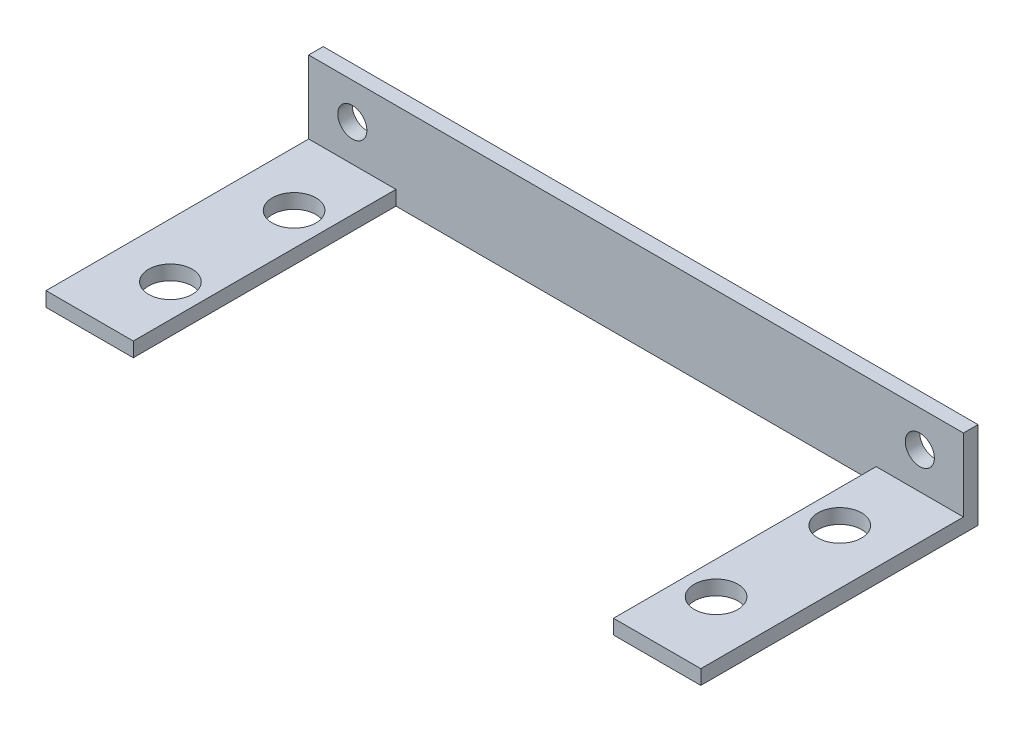
ISO-10303-21;
HEADER;
FILE_DESCRIPTION(('STEP AP214'),'2;1');
FILE_NAME('part.step','',(''),(''),'','','');
FILE_SCHEMA(('AUTOMOTIVE_DESIGN { 1 0 10303 214 1 1 1 1 }'));
ENDSEC;
DATA;
#1=APPLICATION_CONTEXT('core data for automotive mechanical design processes');
#2=APPLICATION_PROTOCOL_DEFINITION('international standard','automotive_design',2000,#1);
#3=PRODUCT_CONTEXT('',#1,'mechanical');
#4=PRODUCT('Part','Part','',(#3));
#5=PRODUCT_RELATED_PRODUCT_CATEGORY('part','',(#4));
#6=PRODUCT_DEFINITION_FORMATION('','',#4);
#7=PRODUCT_DEFINITION_CONTEXT('part definition',#1,'design');
#8=PRODUCT_DEFINITION('design','',#6,#7);
#9=PRODUCT_DEFINITION_SHAPE('','',#8);
#10=(LENGTH_UNIT() NAMED_UNIT(*) SI_UNIT(.MILLI.,.METRE.));
#11=(NAMED_UNIT(*) PLANE_ANGLE_UNIT() SI_UNIT($,.RADIAN.));
#12=(NAMED_UNIT(*) SI_UNIT($,.STERADIAN.) SOLID_ANGLE_UNIT());
#13=UNCERTAINTY_MEASURE_WITH_UNIT(LENGTH_MEASURE(1.E-05),#10,'distance_accuracy_value','');
#14=(GEOMETRIC_REPRESENTATION_CONTEXT(3) GLOBAL_UNCERTAINTY_ASSIGNED_CONTEXT((#13)) GLOBAL_UNIT_ASSIGNED_CONTEXT((#10,
#11,#12)) REPRESENTATION_CONTEXT('',''));
#15=CARTESIAN_POINT('',(0.,0.,0.));
#16=DIRECTION('',(0.,0.,1.));
#17=DIRECTION('',(1.,0.,0.));
#18=AXIS2_PLACEMENT_3D('',#15,#16,#17);
#19=CARTESIAN_POINT('',(45.,0.,38.1));
#20=DIRECTION('',(0.,0.,1.));
#21=DIRECTION('',(1.,0.,0.));
#22=AXIS2_PLACEMENT_3D('',#19,#20,#21);
#23=PLANE('',#22);
#24=DIRECTION('',(0.,-1.,0.));
#25=VECTOR('',#24,1.);
#26=CARTESIAN_POINT('',(-33.,0.,38.1));
#27=LINE('',#26,#25);
#28=CARTESIAN_POINT('',(-33.,2.,38.1));
#29=VERTEX_POINT('',#28);
#30=CARTESIAN_POINT('',(-33.,0.,38.1));
#31=VERTEX_POINT('',#30);
#32=EDGE_CURVE('E146',#29,#31,#27,.T.);
#33=ORIENTED_EDGE('',*,*,#32,.F.);
#34=DIRECTION('',(-1.,0.,0.));
#35=VECTOR('',#34,1.);
#36=CARTESIAN_POINT('',(45.,2.,38.1));
#37=LINE('',#36,#35);
#38=CARTESIAN_POINT('',(-45.,2.,38.1));
#39=VERTEX_POINT('',#38);
#40=EDGE_CURVE('E94',#29,#39,#37,.T.);
#41=ORIENTED_EDGE('',*,*,#40,.T.);
#42=DIRECTION('',(0.,1.,0.));
#43=VECTOR('',#42,1.);
#44=CARTESIAN_POINT('',(-45.,0.,38.1));
#45=LINE('',#44,#43);
#46=CARTESIAN_POINT('',(-45.,0.,38.1));
#47=VERTEX_POINT('',#46);
#48=EDGE_CURVE('E142',#47,#39,#45,.T.);
#49=ORIENTED_EDGE('',*,*,#48,.F.);
#50=DIRECTION('',(-1.,0.,0.));
#51=VECTOR('',#50,1.);
#52=CARTESIAN_POINT('',(45.,0.,38.1));
#53=LINE('',#52,#51);
#54=EDGE_CURVE('E165',#31,#47,#53,.T.);
#55=ORIENTED_EDGE('',*,*,#54,.F.);
#56=EDGE_LOOP('',(#33,#41,#49,#55));
#57=FACE_BOUND('',#56,.T.);
#58=ADVANCED_FACE('F41',(#57),#23,.T.);
#59=CARTESIAN_POINT('',(45.,2.,0.));
#60=DIRECTION('',(0.,-1.,0.));
#61=DIRECTION('',(0.,0.,-1.));
#62=AXIS2_PLACEMENT_3D('',#59,#60,#61);
#63=PLANE('',#62);
#64=CARTESIAN_POINT('',(-37.5000000000001,2.,28.5));
#65=DIRECTION('',(0.,1.,0.));
#66=DIRECTION('',(0.,0.,1.));
#67=AXIS2_PLACEMENT_3D('',#64,#65,#66);
#68=CIRCLE('',#67,3.);
#69=CARTESIAN_POINT('',(-37.5000000000001,2.,31.5));
#70=VERTEX_POINT('',#69);
#71=EDGE_CURVE('E172',#70,#70,#68,.T.);
#72=ORIENTED_EDGE('',*,*,#71,.F.);
#73=EDGE_LOOP('',(#72));
#74=FACE_BOUND('',#73,.T.);
#75=CARTESIAN_POINT('',(-37.5000000000001,2.,11.5));
#76=DIRECTION('',(0.,1.,0.));
#77=DIRECTION('',(0.,0.,-1.));
#78=AXIS2_PLACEMENT_3D('',#75,#76,#77);
#79=CIRCLE('',#78,3.);
#80=CARTESIAN_POINT('',(-37.5000000000001,2.,8.49999999999999));
#81=VERTEX_POINT('',#80);
#82=EDGE_CURVE('E197',#81,#81,#79,.T.);
#83=ORIENTED_EDGE('',*,*,#82,.F.);
#84=EDGE_LOOP('',(#83));
#85=FACE_BOUND('',#84,.T.);
#86=ORIENTED_EDGE('',*,*,#40,.F.);
#87=DIRECTION('',(0.,0.,1.));
#88=VECTOR('',#87,1.);
#89=CARTESIAN_POINT('',(-33.,2.,50.8));
#90=LINE('',#89,#88);
#91=CARTESIAN_POINT('',(-33.,2.,1.99999999999999));
#92=VERTEX_POINT('',#91);
#93=EDGE_CURVE('E184',#92,#29,#90,.T.);
#94=ORIENTED_EDGE('',*,*,#93,.F.);
#95=DIRECTION('',(-1.,0.,0.));
#96=VECTOR('',#95,1.);
#97=CARTESIAN_POINT('',(45.,2.,2.));
#98=LINE('',#97,#96);
#99=CARTESIAN_POINT('',(-45.,2.,2.));
#100=VERTEX_POINT('',#99);
#101=EDGE_CURVE('E159',#92,#100,#98,.T.);
#102=ORIENTED_EDGE('',*,*,#101,.T.);
#103=DIRECTION('',(0.,0.,1.));
#104=VECTOR('',#103,1.);
#105=CARTESIAN_POINT('',(-45.,2.,0.));
#106=LINE('',#105,#104);
#107=EDGE_CURVE('E153',#100,#39,#106,.T.);
#108=ORIENTED_EDGE('',*,*,#107,.T.);
#109=EDGE_LOOP('',(#86,#94,#102,#108));
#110=FACE_BOUND('',#109,.T.);
#111=ADVANCED_FACE('F247',(#74,#85,#110),#63,.F.);
#112=DIRECTION('',(0.,1.,0.));
#113=VECTOR('',#112,1.);
#114=CARTESIAN_POINT('',(33.,0.,38.1));
#115=LINE('',#114,#113);
#116=CARTESIAN_POINT('',(33.,0.,38.1));
#117=VERTEX_POINT('',#116);
#118=CARTESIAN_POINT('',(33.,2.,38.1));
#119=VERTEX_POINT('',#118);
#120=EDGE_CURVE('E58',#117,#119,#115,.T.);
#121=ORIENTED_EDGE('',*,*,#120,.F.);
#122=CARTESIAN_POINT('',(45.,0.,38.1));
#123=VERTEX_POINT('',#122);
#124=EDGE_CURVE('E50',#123,#117,#53,.T.);
#125=ORIENTED_EDGE('',*,*,#124,.F.);
#126=DIRECTION('',(0.,1.,0.));
#127=VECTOR('',#126,1.);
#128=CARTESIAN_POINT('',(45.,0.,38.1));
#129=LINE('',#128,#127);
#130=CARTESIAN_POINT('',(45.,2.,38.1));
#131=VERTEX_POINT('',#130);
#132=EDGE_CURVE('E155',#123,#131,#129,.T.);
#133=ORIENTED_EDGE('',*,*,#132,.T.);
#134=EDGE_CURVE('E156',#131,#119,#37,.T.);
#135=ORIENTED_EDGE('',*,*,#134,.T.);
#136=EDGE_LOOP('',(#121,#125,#133,#135));
#137=FACE_BOUND('',#136,.T.);
#138=ADVANCED_FACE('F43',(#137),#23,.T.);
#139=CARTESIAN_POINT('',(45.,0.,0.));
#140=DIRECTION('',(0.,1.,0.));
#141=DIRECTION('',(0.,0.,1.));
#142=AXIS2_PLACEMENT_3D('',#139,#140,#141);
#143=PLANE('',#142);
#144=CARTESIAN_POINT('',(-37.5000000000001,0.,28.5));
#145=DIRECTION('',(0.,1.,0.));
#146=DIRECTION('',(0.,0.,1.));
#147=AXIS2_PLACEMENT_3D('',#144,#145,#146);
#148=CIRCLE('',#147,3.);
#149=CARTESIAN_POINT('',(-37.5000000000001,0.,31.5));
#150=VERTEX_POINT('',#149);
#151=EDGE_CURVE('E200',#150,#150,#148,.T.);
#152=ORIENTED_EDGE('',*,*,#151,.T.);
#153=EDGE_LOOP('',(#152));
#154=FACE_BOUND('',#153,.T.);
#155=CARTESIAN_POINT('',(-37.5000000000001,0.,11.5));
#156=DIRECTION('',(0.,1.,0.));
#157=DIRECTION('',(0.,0.,-1.));
#158=AXIS2_PLACEMENT_3D('',#155,#156,#157);
#159=CIRCLE('',#158,3.);
#160=CARTESIAN_POINT('',(-37.5000000000001,0.,8.49999999999999));
#161=VERTEX_POINT('',#160);
#162=EDGE_CURVE('E194',#161,#161,#159,.T.);
#163=ORIENTED_EDGE('',*,*,#162,.T.);
#164=EDGE_LOOP('',(#163));
#165=FACE_BOUND('',#164,.T.);
#166=CARTESIAN_POINT('',(37.5000000000001,0.,28.5));
#167=DIRECTION('',(0.,1.,0.));
#168=DIRECTION('',(0.,0.,-1.));
#169=AXIS2_PLACEMENT_3D('',#166,#167,#168);
#170=CIRCLE('',#169,3.);
#171=CARTESIAN_POINT('',(37.5000000000001,0.,25.5));
#172=VERTEX_POINT('',#171);
#173=EDGE_CURVE('E188',#172,#172,#170,.T.);
#174=ORIENTED_EDGE('',*,*,#173,.T.);
#175=EDGE_LOOP('',(#174));
#176=FACE_BOUND('',#175,.T.);
#177=CARTESIAN_POINT('',(37.5000000000001,0.,11.5));
#178=DIRECTION('',(0.,1.,0.));
#179=DIRECTION('',(0.,0.,1.));
#180=AXIS2_PLACEMENT_3D('',#177,#178,#179);
#181=CIRCLE('',#180,3.);
#182=CARTESIAN_POINT('',(37.5000000000001,0.,14.5));
#183=VERTEX_POINT('',#182);
#184=EDGE_CURVE('E181',#183,#183,#181,.T.);
#185=ORIENTED_EDGE('',*,*,#184,.T.);
#186=EDGE_LOOP('',(#185));
#187=FACE_BOUND('',#186,.T.);
#188=DIRECTION('',(-1.,0.,0.));
#189=VECTOR('',#188,1.);
#190=CARTESIAN_POINT('',(-33.,0.,1.99999999999999));
#191=LINE('',#190,#189);
#192=CARTESIAN_POINT('',(33.,0.,1.99999999999999));
#193=VERTEX_POINT('',#192);
#194=CARTESIAN_POINT('',(-33.,0.,1.99999999999999));
#195=VERTEX_POINT('',#194);
#196=EDGE_CURVE('E211',#193,#195,#191,.T.);
#197=ORIENTED_EDGE('',*,*,#196,.T.);
#198=DIRECTION('',(0.,0.,1.));
#199=VECTOR('',#198,1.);
#200=CARTESIAN_POINT('',(-33.,0.,50.8));
#201=LINE('',#200,#199);
#202=EDGE_CURVE('E205',#195,#31,#201,.T.);
#203=ORIENTED_EDGE('',*,*,#202,.T.);
#204=ORIENTED_EDGE('',*,*,#54,.T.);
#205=DIRECTION('',(0.,0.,-1.));
#206=VECTOR('',#205,1.);
#207=CARTESIAN_POINT('',(-45.,0.,0.));
#208=LINE('',#207,#206);
#209=CARTESIAN_POINT('',(-45.,0.,0.));
#210=VERTEX_POINT('',#209);
#211=EDGE_CURVE('E145',#47,#210,#208,.T.);
#212=ORIENTED_EDGE('',*,*,#211,.T.);
#213=DIRECTION('',(-1.,0.,0.));
#214=VECTOR('',#213,1.);
#215=CARTESIAN_POINT('',(45.,0.,0.));
#216=LINE('',#215,#214);
#217=CARTESIAN_POINT('',(45.,0.,0.));
#218=VERTEX_POINT('',#217);
#219=EDGE_CURVE('E162',#218,#210,#216,.T.);
#220=ORIENTED_EDGE('',*,*,#219,.F.);
#221=DIRECTION('',(0.,0.,-1.));
#222=VECTOR('',#221,1.);
#223=CARTESIAN_POINT('',(45.,0.,0.));
#224=LINE('',#223,#222);
#225=EDGE_CURVE('E225',#123,#218,#224,.T.);
#226=ORIENTED_EDGE('',*,*,#225,.F.);
#227=ORIENTED_EDGE('',*,*,#124,.T.);
#228=DIRECTION('',(0.,0.,-1.));
#229=VECTOR('',#228,1.);
#230=CARTESIAN_POINT('',(33.,0.,50.8));
#231=LINE('',#230,#229);
#232=EDGE_CURVE('E208',#117,#193,#231,.T.);
#233=ORIENTED_EDGE('',*,*,#232,.T.);
#234=EDGE_LOOP('',(#197,#203,#204,#212,#220,#226,#227,#233));
#235=FACE_BOUND('',#234,.T.);
#236=ADVANCED_FACE('F228',(#154,#165,#176,#187,#235),#143,.F.);
#237=CARTESIAN_POINT('',(45.,0.,0.));
#238=DIRECTION('',(0.,0.,1.));
#239=DIRECTION('',(1.,0.,0.));
#240=AXIS2_PLACEMENT_3D('',#237,#238,#239);
#241=PLANE('',#240);
#242=CARTESIAN_POINT('',(-39.,7.,0.));
#243=DIRECTION('',(0.,0.,1.));
#244=DIRECTION('',(1.,0.,0.));
#245=AXIS2_PLACEMENT_3D('',#242,#243,#244);
#246=CIRCLE('',#245,2.);
#247=CARTESIAN_POINT('',(-37.,7.,0.));
#248=VERTEX_POINT('',#247);
#249=EDGE_CURVE('E168',#248,#248,#246,.T.);
#250=ORIENTED_EDGE('',*,*,#249,.T.);
#251=EDGE_LOOP('',(#250));
#252=FACE_BOUND('',#251,.T.);
#253=CARTESIAN_POINT('',(39.,7.,0.));
#254=DIRECTION('',(0.,0.,1.));
#255=DIRECTION('',(-1.,0.,0.));
#256=AXIS2_PLACEMENT_3D('',#253,#254,#255);
#257=CIRCLE('',#256,2.);
#258=CARTESIAN_POINT('',(37.,7.,0.));
#259=VERTEX_POINT('',#258);
#260=EDGE_CURVE('E174',#259,#259,#257,.T.);
#261=ORIENTED_EDGE('',*,*,#260,.T.);
#262=EDGE_LOOP('',(#261));
#263=FACE_BOUND('',#262,.T.);
#264=DIRECTION('',(0.,1.,0.));
#265=VECTOR('',#264,1.);
#266=CARTESIAN_POINT('',(-45.,0.,0.));
#267=LINE('',#266,#265);
#268=CARTESIAN_POINT('',(-45.,12.,0.));
#269=VERTEX_POINT('',#268);
#270=EDGE_CURVE('E148',#210,#269,#267,.T.);
#271=ORIENTED_EDGE('',*,*,#270,.T.);
#272=DIRECTION('',(-1.,0.,0.));
#273=VECTOR('',#272,1.);
#274=CARTESIAN_POINT('',(45.,12.,0.));
#275=LINE('',#274,#273);
#276=CARTESIAN_POINT('',(45.,12.,0.));
#277=VERTEX_POINT('',#276);
#278=EDGE_CURVE('E132',#277,#269,#275,.T.);
#279=ORIENTED_EDGE('',*,*,#278,.F.);
#280=DIRECTION('',(0.,1.,0.));
#281=VECTOR('',#280,1.);
#282=CARTESIAN_POINT('',(45.,0.,0.));
#283=LINE('',#282,#281);
#284=EDGE_CURVE('E119',#218,#277,#283,.T.);
#285=ORIENTED_EDGE('',*,*,#284,.F.);
#286=ORIENTED_EDGE('',*,*,#219,.T.);
#287=EDGE_LOOP('',(#271,#279,#285,#286));
#288=FACE_BOUND('',#287,.T.);
#289=ADVANCED_FACE('F232',(#252,#263,#288),#241,.F.);
#290=CARTESIAN_POINT('',(45.,12.,0.));
#291=DIRECTION('',(0.,-1.,0.));
#292=DIRECTION('',(0.,0.,-1.));
#293=AXIS2_PLACEMENT_3D('',#290,#291,#292);
#294=PLANE('',#293);
#295=DIRECTION('',(0.,0.,1.));
#296=VECTOR('',#295,1.);
#297=CARTESIAN_POINT('',(-45.,12.,0.));
#298=LINE('',#297,#296);
#299=CARTESIAN_POINT('',(-45.,12.,2.));
#300=VERTEX_POINT('',#299);
#301=EDGE_CURVE('E128',#269,#300,#298,.T.);
#302=ORIENTED_EDGE('',*,*,#301,.T.);
#303=DIRECTION('',(-1.,0.,0.));
#304=VECTOR('',#303,1.);
#305=CARTESIAN_POINT('',(45.,12.,2.));
#306=LINE('',#305,#304);
#307=CARTESIAN_POINT('',(45.,12.,2.));
#308=VERTEX_POINT('',#307);
#309=EDGE_CURVE('E125',#308,#300,#306,.T.);
#310=ORIENTED_EDGE('',*,*,#309,.F.);
#311=DIRECTION('',(0.,0.,1.));
#312=VECTOR('',#311,1.);
#313=CARTESIAN_POINT('',(45.,12.,0.));
#314=LINE('',#313,#312);
#315=EDGE_CURVE('E112',#277,#308,#314,.T.);
#316=ORIENTED_EDGE('',*,*,#315,.F.);
#317=ORIENTED_EDGE('',*,*,#278,.T.);
#318=EDGE_LOOP('',(#302,#310,#316,#317));
#319=FACE_BOUND('',#318,.T.);
#320=ADVANCED_FACE('F126',(#319),#294,.F.);
#321=CARTESIAN_POINT('',(45.,0.,2.));
#322=DIRECTION('',(0.,0.,-1.));
#323=DIRECTION('',(0.,1.,0.));
#324=AXIS2_PLACEMENT_3D('',#321,#322,#323);
#325=PLANE('',#324);
#326=CARTESIAN_POINT('',(-39.,7.,2.));
#327=DIRECTION('',(0.,0.,-1.));
#328=DIRECTION('',(0.,1.,0.));
#329=AXIS2_PLACEMENT_3D('',#326,#327,#328);
#330=CIRCLE('',#329,2.);
#331=CARTESIAN_POINT('',(-39.,9.00000000000001,2.));
#332=VERTEX_POINT('',#331);
#333=EDGE_CURVE('E45',#332,#332,#330,.T.);
#334=ORIENTED_EDGE('',*,*,#333,.T.);
#335=EDGE_LOOP('',(#334));
#336=FACE_BOUND('',#335,.T.);
#337=CARTESIAN_POINT('',(39.,7.,2.));
#338=DIRECTION('',(0.,0.,-1.));
#339=DIRECTION('',(0.,1.,0.));
#340=AXIS2_PLACEMENT_3D('',#337,#338,#339);
#341=CIRCLE('',#340,2.);
#342=CARTESIAN_POINT('',(39.,9.00000000000001,2.));
#343=VERTEX_POINT('',#342);
#344=EDGE_CURVE('E166',#343,#343,#341,.T.);
#345=ORIENTED_EDGE('',*,*,#344,.T.);
#346=EDGE_LOOP('',(#345));
#347=FACE_BOUND('',#346,.T.);
#348=DIRECTION('',(0.,-1.,0.));
#349=VECTOR('',#348,1.);
#350=CARTESIAN_POINT('',(-45.,0.,2.));
#351=LINE('',#350,#349);
#352=EDGE_CURVE('E151',#300,#100,#351,.T.);
#353=ORIENTED_EDGE('',*,*,#352,.T.);
#354=ORIENTED_EDGE('',*,*,#101,.F.);
#355=DIRECTION('',(0.,1.,0.));
#356=VECTOR('',#355,1.);
#357=CARTESIAN_POINT('',(-33.,0.,1.99999999999999));
#358=LINE('',#357,#356);
#359=EDGE_CURVE('E217',#195,#92,#358,.T.);
#360=ORIENTED_EDGE('',*,*,#359,.F.);
#361=ORIENTED_EDGE('',*,*,#196,.F.);
#362=DIRECTION('',(0.,1.,0.));
#363=VECTOR('',#362,1.);
#364=CARTESIAN_POINT('',(33.,0.,1.99999999999999));
#365=LINE('',#364,#363);
#366=CARTESIAN_POINT('',(33.,2.,1.99999999999999));
#367=VERTEX_POINT('',#366);
#368=EDGE_CURVE('E214',#193,#367,#365,.T.);
#369=ORIENTED_EDGE('',*,*,#368,.T.);
#370=CARTESIAN_POINT('',(45.,2.,2.));
#371=VERTEX_POINT('',#370);
#372=EDGE_CURVE('E133',#371,#367,#98,.T.);
#373=ORIENTED_EDGE('',*,*,#372,.F.);
#374=DIRECTION('',(0.,-1.,0.));
#375=VECTOR('',#374,1.);
#376=CARTESIAN_POINT('',(45.,0.,2.));
#377=LINE('',#376,#375);
#378=EDGE_CURVE('E116',#308,#371,#377,.T.);
#379=ORIENTED_EDGE('',*,*,#378,.F.);
#380=ORIENTED_EDGE('',*,*,#309,.T.);
#381=EDGE_LOOP('',(#353,#354,#360,#361,#369,#373,#379,#380));
#382=FACE_BOUND('',#381,.T.);
#383=ADVANCED_FACE('F135',(#336,#347,#382),#325,.F.);
#384=CARTESIAN_POINT('',(37.5000000000001,2.,28.5));
#385=DIRECTION('',(0.,1.,0.));
#386=DIRECTION('',(0.,0.,-1.));
#387=AXIS2_PLACEMENT_3D('',#384,#385,#386);
#388=CIRCLE('',#387,3.);
#389=CARTESIAN_POINT('',(37.5000000000001,2.,25.5));
#390=VERTEX_POINT('',#389);
#391=EDGE_CURVE('E191',#390,#390,#388,.T.);
#392=ORIENTED_EDGE('',*,*,#391,.F.);
#393=EDGE_LOOP('',(#392));
#394=FACE_BOUND('',#393,.T.);
#395=CARTESIAN_POINT('',(37.5000000000001,2.,11.5));
#396=DIRECTION('',(0.,1.,0.));
#397=DIRECTION('',(0.,0.,1.));
#398=AXIS2_PLACEMENT_3D('',#395,#396,#397);
#399=CIRCLE('',#398,3.);
#400=CARTESIAN_POINT('',(37.5000000000001,2.,14.5));
#401=VERTEX_POINT('',#400);
#402=EDGE_CURVE('E185',#401,#401,#399,.T.);
#403=ORIENTED_EDGE('',*,*,#402,.F.);
#404=EDGE_LOOP('',(#403));
#405=FACE_BOUND('',#404,.T.);
#406=ORIENTED_EDGE('',*,*,#372,.T.);
#407=DIRECTION('',(0.,0.,1.));
#408=VECTOR('',#407,1.);
#409=CARTESIAN_POINT('',(33.,2.,0.));
#410=LINE('',#409,#408);
#411=EDGE_CURVE('E11',#367,#119,#410,.T.);
#412=ORIENTED_EDGE('',*,*,#411,.T.);
#413=ORIENTED_EDGE('',*,*,#134,.F.);
#414=DIRECTION('',(0.,0.,1.));
#415=VECTOR('',#414,1.);
#416=CARTESIAN_POINT('',(45.,2.,0.));
#417=LINE('',#416,#415);
#418=EDGE_CURVE('E66',#371,#131,#417,.T.);
#419=ORIENTED_EDGE('',*,*,#418,.F.);
#420=EDGE_LOOP('',(#406,#412,#413,#419));
#421=FACE_BOUND('',#420,.T.);
#422=ADVANCED_FACE('F260',(#394,#405,#421),#63,.F.);
#423=CARTESIAN_POINT('',(45.,0.,0.));
#424=DIRECTION('',(1.,0.,0.));
#425=DIRECTION('',(0.,0.,-1.));
#426=AXIS2_PLACEMENT_3D('',#423,#424,#425);
#427=PLANE('',#426);
#428=ORIENTED_EDGE('',*,*,#132,.F.);
#429=ORIENTED_EDGE('',*,*,#225,.T.);
#430=ORIENTED_EDGE('',*,*,#284,.T.);
#431=ORIENTED_EDGE('',*,*,#315,.T.);
#432=ORIENTED_EDGE('',*,*,#378,.T.);
#433=ORIENTED_EDGE('',*,*,#418,.T.);
#434=EDGE_LOOP('',(#428,#429,#430,#431,#432,#433));
#435=FACE_BOUND('',#434,.T.);
#436=ADVANCED_FACE('F114',(#435),#427,.T.);
#437=CARTESIAN_POINT('',(-45.,0.,0.));
#438=DIRECTION('',(1.,0.,0.));
#439=DIRECTION('',(0.,0.,-1.));
#440=AXIS2_PLACEMENT_3D('',#437,#438,#439);
#441=PLANE('',#440);
#442=ORIENTED_EDGE('',*,*,#48,.T.);
#443=ORIENTED_EDGE('',*,*,#107,.F.);
#444=ORIENTED_EDGE('',*,*,#352,.F.);
#445=ORIENTED_EDGE('',*,*,#301,.F.);
#446=ORIENTED_EDGE('',*,*,#270,.F.);
#447=ORIENTED_EDGE('',*,*,#211,.F.);
#448=EDGE_LOOP('',(#442,#443,#444,#445,#446,#447));
#449=FACE_BOUND('',#448,.T.);
#450=ADVANCED_FACE('F234',(#449),#441,.F.);
#451=CARTESIAN_POINT('',(-33.,0.,50.8));
#452=DIRECTION('',(-1.,0.,0.));
#453=DIRECTION('',(0.,0.,1.));
#454=AXIS2_PLACEMENT_3D('',#451,#452,#453);
#455=PLANE('',#454);
#456=ORIENTED_EDGE('',*,*,#32,.T.);
#457=ORIENTED_EDGE('',*,*,#202,.F.);
#458=ORIENTED_EDGE('',*,*,#359,.T.);
#459=ORIENTED_EDGE('',*,*,#93,.T.);
#460=EDGE_LOOP('',(#456,#457,#458,#459));
#461=FACE_BOUND('',#460,.T.);
#462=ADVANCED_FACE('F250',(#461),#455,.F.);
#463=CARTESIAN_POINT('',(33.,0.,50.8));
#464=DIRECTION('',(1.,0.,0.));
#465=DIRECTION('',(0.,0.,-1.));
#466=AXIS2_PLACEMENT_3D('',#463,#464,#465);
#467=PLANE('',#466);
#468=ORIENTED_EDGE('',*,*,#120,.T.);
#469=ORIENTED_EDGE('',*,*,#411,.F.);
#470=ORIENTED_EDGE('',*,*,#368,.F.);
#471=ORIENTED_EDGE('',*,*,#232,.F.);
#472=EDGE_LOOP('',(#468,#469,#470,#471));
#473=FACE_BOUND('',#472,.T.);
#474=ADVANCED_FACE('F258',(#473),#467,.F.);
#475=CARTESIAN_POINT('',(37.5000000000001,0.,11.5));
#476=DIRECTION('',(0.,1.,0.));
#477=DIRECTION('',(0.,0.,1.));
#478=AXIS2_PLACEMENT_3D('',#475,#476,#477);
#479=CYLINDRICAL_SURFACE('',#478,3.);
#480=ORIENTED_EDGE('',*,*,#184,.F.);
#481=EDGE_LOOP('',(#480));
#482=FACE_BOUND('',#481,.T.);
#483=ORIENTED_EDGE('',*,*,#402,.T.);
#484=EDGE_LOOP('',(#483));
#485=FACE_BOUND('',#484,.T.);
#486=ADVANCED_FACE('F333',(#482,#485),#479,.F.);
#487=CARTESIAN_POINT('',(37.5000000000001,0.,28.5));
#488=DIRECTION('',(0.,1.,0.));
#489=DIRECTION('',(0.,0.,1.));
#490=AXIS2_PLACEMENT_3D('',#487,#488,#489);
#491=CYLINDRICAL_SURFACE('',#490,3.);
#492=ORIENTED_EDGE('',*,*,#173,.F.);
#493=EDGE_LOOP('',(#492));
#494=FACE_BOUND('',#493,.T.);
#495=ORIENTED_EDGE('',*,*,#391,.T.);
#496=EDGE_LOOP('',(#495));
#497=FACE_BOUND('',#496,.T.);
#498=ADVANCED_FACE('F340',(#494,#497),#491,.F.);
#499=CARTESIAN_POINT('',(-37.5000000000001,0.,11.5));
#500=DIRECTION('',(0.,1.,0.));
#501=DIRECTION('',(0.,0.,1.));
#502=AXIS2_PLACEMENT_3D('',#499,#500,#501);
#503=CYLINDRICAL_SURFACE('',#502,3.);
#504=ORIENTED_EDGE('',*,*,#162,.F.);
#505=EDGE_LOOP('',(#504));
#506=FACE_BOUND('',#505,.T.);
#507=ORIENTED_EDGE('',*,*,#82,.T.);
#508=EDGE_LOOP('',(#507));
#509=FACE_BOUND('',#508,.T.);
#510=ADVANCED_FACE('F348',(#506,#509),#503,.F.);
#511=CARTESIAN_POINT('',(-37.5000000000001,0.,28.5));
#512=DIRECTION('',(0.,1.,0.));
#513=DIRECTION('',(0.,0.,1.));
#514=AXIS2_PLACEMENT_3D('',#511,#512,#513);
#515=CYLINDRICAL_SURFACE('',#514,3.);
#516=ORIENTED_EDGE('',*,*,#151,.F.);
#517=EDGE_LOOP('',(#516));
#518=FACE_BOUND('',#517,.T.);
#519=ORIENTED_EDGE('',*,*,#71,.T.);
#520=EDGE_LOOP('',(#519));
#521=FACE_BOUND('',#520,.T.);
#522=ADVANCED_FACE('F356',(#518,#521),#515,.F.);
#523=CARTESIAN_POINT('',(39.,7.,0.));
#524=DIRECTION('',(0.,0.,1.));
#525=DIRECTION('',(1.,0.,0.));
#526=AXIS2_PLACEMENT_3D('',#523,#524,#525);
#527=CYLINDRICAL_SURFACE('',#526,2.);
#528=ORIENTED_EDGE('',*,*,#260,.F.);
#529=EDGE_LOOP('',(#528));
#530=FACE_BOUND('',#529,.T.);
#531=ORIENTED_EDGE('',*,*,#344,.F.);
#532=EDGE_LOOP('',(#531));
#533=FACE_BOUND('',#532,.T.);
#534=ADVANCED_FACE('F363',(#530,#533),#527,.F.);
#535=CARTESIAN_POINT('',(-39.,7.,0.));
#536=DIRECTION('',(0.,0.,1.));
#537=DIRECTION('',(1.,0.,0.));
#538=AXIS2_PLACEMENT_3D('',#535,#536,#537);
#539=CYLINDRICAL_SURFACE('',#538,2.);
#540=ORIENTED_EDGE('',*,*,#249,.F.);
#541=EDGE_LOOP('',(#540));
#542=FACE_BOUND('',#541,.T.);
#543=ORIENTED_EDGE('',*,*,#333,.F.);
#544=EDGE_LOOP('',(#543));
#545=FACE_BOUND('',#544,.T.);
#546=ADVANCED_FACE('F375',(#542,#545),#539,.F.);
#547=CLOSED_SHELL('',(#58,#111,#138,#236,#289,#320,#383,#422,#436,#450,#462,#474,#486,#498,#510,
#522,#534,#546));
#548=MANIFOLD_SOLID_BREP('B2',#547);
#549=ADVANCED_BREP_SHAPE_REPRESENTATION('',(#18,#548),#14);
#550=SHAPE_DEFINITION_REPRESENTATION(#9,#549);
ENDSEC;
END-ISO-10303-21;
